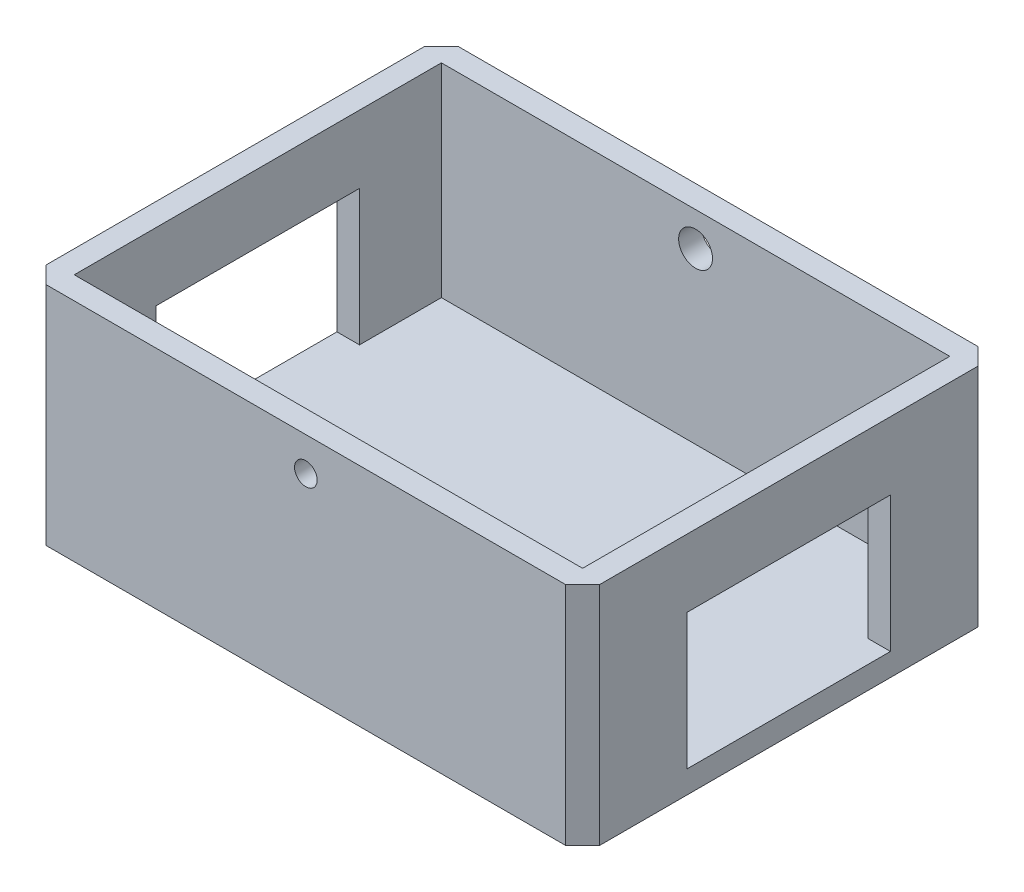
ISO-10303-21;
HEADER;
FILE_DESCRIPTION(('STEP AP214'),'2;1');
FILE_NAME('part.step','',(''),(''),'','','');
FILE_SCHEMA(('AUTOMOTIVE_DESIGN { 1 0 10303 214 1 1 1 1 }'));
ENDSEC;
DATA;
#1=APPLICATION_CONTEXT('core data for automotive mechanical design processes');
#2=APPLICATION_PROTOCOL_DEFINITION('international standard','automotive_design',2000,#1);
#3=PRODUCT_CONTEXT('',#1,'mechanical');
#4=PRODUCT('Part','Part','',(#3));
#5=PRODUCT_RELATED_PRODUCT_CATEGORY('part','',(#4));
#6=PRODUCT_DEFINITION_FORMATION('','',#4);
#7=PRODUCT_DEFINITION_CONTEXT('part definition',#1,'design');
#8=PRODUCT_DEFINITION('design','',#6,#7);
#9=PRODUCT_DEFINITION_SHAPE('','',#8);
#10=(LENGTH_UNIT() NAMED_UNIT(*) SI_UNIT(.MILLI.,.METRE.));
#11=(NAMED_UNIT(*) PLANE_ANGLE_UNIT() SI_UNIT($,.RADIAN.));
#12=(NAMED_UNIT(*) SI_UNIT($,.STERADIAN.) SOLID_ANGLE_UNIT());
#13=UNCERTAINTY_MEASURE_WITH_UNIT(LENGTH_MEASURE(1.E-05),#10,'distance_accuracy_value','');
#14=(GEOMETRIC_REPRESENTATION_CONTEXT(3) GLOBAL_UNCERTAINTY_ASSIGNED_CONTEXT((#13)) GLOBAL_UNIT_ASSIGNED_CONTEXT((#10,
#11,#12)) REPRESENTATION_CONTEXT('',''));
#15=CARTESIAN_POINT('',(0.,0.,0.));
#16=DIRECTION('',(0.,0.,1.));
#17=DIRECTION('',(1.,0.,0.));
#18=AXIS2_PLACEMENT_3D('',#15,#16,#17);
#19=CARTESIAN_POINT('',(-12.25,10.,-9.125));
#20=DIRECTION('',(1.,0.,0.));
#21=DIRECTION('',(0.,0.,-1.));
#22=AXIS2_PLACEMENT_3D('',#19,#20,#21);
#23=PLANE('',#22);
#24=DIRECTION('',(0.,0.,1.));
#25=VECTOR('',#24,1.);
#26=CARTESIAN_POINT('',(-12.25,0.,-9.125));
#27=LINE('',#26,#25);
#28=CARTESIAN_POINT('',(-12.25,0.,-8.375));
#29=VERTEX_POINT('',#28);
#30=CARTESIAN_POINT('',(-12.25,0.,8.375));
#31=VERTEX_POINT('',#30);
#32=EDGE_CURVE('E245',#29,#31,#27,.T.);
#33=ORIENTED_EDGE('',*,*,#32,.T.);
#34=DIRECTION('',(0.,1.,0.));
#35=VECTOR('',#34,1.);
#36=CARTESIAN_POINT('',(-12.25,10.,8.375));
#37=LINE('',#36,#35);
#38=CARTESIAN_POINT('',(-12.25,10.,8.375));
#39=VERTEX_POINT('',#38);
#40=EDGE_CURVE('E265',#31,#39,#37,.T.);
#41=ORIENTED_EDGE('',*,*,#40,.T.);
#42=DIRECTION('',(0.,0.,1.));
#43=VECTOR('',#42,1.);
#44=CARTESIAN_POINT('',(-12.25,10.,-9.125));
#45=LINE('',#44,#43);
#46=CARTESIAN_POINT('',(-12.25,10.,-8.375));
#47=VERTEX_POINT('',#46);
#48=EDGE_CURVE('E231',#47,#39,#45,.T.);
#49=ORIENTED_EDGE('',*,*,#48,.F.);
#50=DIRECTION('',(0.,-1.,0.));
#51=VECTOR('',#50,1.);
#52=CARTESIAN_POINT('',(-12.25,10.,-8.375));
#53=LINE('',#52,#51);
#54=EDGE_CURVE('E262',#47,#29,#53,.T.);
#55=ORIENTED_EDGE('',*,*,#54,.T.);
#56=EDGE_LOOP('',(#33,#41,#49,#55));
#57=FACE_BOUND('',#56,.T.);
#58=DIRECTION('',(0.,1.,0.));
#59=VECTOR('',#58,1.);
#60=CARTESIAN_POINT('',(-12.25,7.,-4.5));
#61=LINE('',#60,#59);
#62=CARTESIAN_POINT('',(-12.25,0.999999999999999,-4.5));
#63=VERTEX_POINT('',#62);
#64=CARTESIAN_POINT('',(-12.25,7.,-4.5));
#65=VERTEX_POINT('',#64);
#66=EDGE_CURVE('E59',#63,#65,#61,.T.);
#67=ORIENTED_EDGE('',*,*,#66,.T.);
#68=DIRECTION('',(0.,0.,1.));
#69=VECTOR('',#68,1.);
#70=CARTESIAN_POINT('',(-12.25,7.,4.5));
#71=LINE('',#70,#69);
#72=CARTESIAN_POINT('',(-12.25,7.,4.5));
#73=VERTEX_POINT('',#72);
#74=EDGE_CURVE('E188',#65,#73,#71,.T.);
#75=ORIENTED_EDGE('',*,*,#74,.T.);
#76=DIRECTION('',(0.,-1.,0.));
#77=VECTOR('',#76,1.);
#78=CARTESIAN_POINT('',(-12.25,7.,4.5));
#79=LINE('',#78,#77);
#80=CARTESIAN_POINT('',(-12.25,1.,4.5));
#81=VERTEX_POINT('',#80);
#82=EDGE_CURVE('E618',#73,#81,#79,.T.);
#83=ORIENTED_EDGE('',*,*,#82,.T.);
#84=DIRECTION('',(0.,0.,-1.));
#85=VECTOR('',#84,1.);
#86=CARTESIAN_POINT('',(-12.25,1.,4.5));
#87=LINE('',#86,#85);
#88=EDGE_CURVE('E621',#81,#63,#87,.T.);
#89=ORIENTED_EDGE('',*,*,#88,.T.);
#90=EDGE_LOOP('',(#67,#75,#83,#89));
#91=FACE_BOUND('',#90,.T.);
#92=ADVANCED_FACE('F43',(#57,#91),#23,.F.);
#93=CARTESIAN_POINT('',(-11.25,10.,-9.125));
#94=DIRECTION('',(1.,0.,0.));
#95=DIRECTION('',(0.,0.,-1.));
#96=AXIS2_PLACEMENT_3D('',#93,#94,#95);
#97=PLANE('',#96);
#98=DIRECTION('',(0.,0.,1.));
#99=VECTOR('',#98,1.);
#100=CARTESIAN_POINT('',(-11.25,7.,4.50000000000001));
#101=LINE('',#100,#99);
#102=CARTESIAN_POINT('',(-11.25,7.,-4.5));
#103=VERTEX_POINT('',#102);
#104=CARTESIAN_POINT('',(-11.25,7.,4.5));
#105=VERTEX_POINT('',#104);
#106=EDGE_CURVE('E196',#103,#105,#101,.T.);
#107=ORIENTED_EDGE('',*,*,#106,.F.);
#108=DIRECTION('',(0.,1.,0.));
#109=VECTOR('',#108,1.);
#110=CARTESIAN_POINT('',(-11.25,7.,-4.5));
#111=LINE('',#110,#109);
#112=CARTESIAN_POINT('',(-11.25,0.999999999999999,-4.5));
#113=VERTEX_POINT('',#112);
#114=EDGE_CURVE('E181',#113,#103,#111,.T.);
#115=ORIENTED_EDGE('',*,*,#114,.F.);
#116=DIRECTION('',(0.,0.,1.));
#117=VECTOR('',#116,1.);
#118=CARTESIAN_POINT('',(-11.25,0.999999999999999,-9.125));
#119=LINE('',#118,#117);
#120=CARTESIAN_POINT('',(-11.25,1.,-8.125));
#121=VERTEX_POINT('',#120);
#122=EDGE_CURVE('E194',#121,#113,#119,.T.);
#123=ORIENTED_EDGE('',*,*,#122,.F.);
#124=DIRECTION('',(0.,-1.,0.));
#125=VECTOR('',#124,1.);
#126=CARTESIAN_POINT('',(-11.25,10.,-8.125));
#127=LINE('',#126,#125);
#128=CARTESIAN_POINT('',(-11.25,10.,-8.125));
#129=VERTEX_POINT('',#128);
#130=EDGE_CURVE('E210',#129,#121,#127,.T.);
#131=ORIENTED_EDGE('',*,*,#130,.F.);
#132=DIRECTION('',(0.,0.,1.));
#133=VECTOR('',#132,1.);
#134=CARTESIAN_POINT('',(-11.25,10.,-9.125));
#135=LINE('',#134,#133);
#136=CARTESIAN_POINT('',(-11.25,10.,8.125));
#137=VERTEX_POINT('',#136);
#138=EDGE_CURVE('E219',#129,#137,#135,.T.);
#139=ORIENTED_EDGE('',*,*,#138,.T.);
#140=DIRECTION('',(0.,-1.,0.));
#141=VECTOR('',#140,1.);
#142=CARTESIAN_POINT('',(-11.25,10.,8.125));
#143=LINE('',#142,#141);
#144=CARTESIAN_POINT('',(-11.25,1.,8.125));
#145=VERTEX_POINT('',#144);
#146=EDGE_CURVE('E212',#137,#145,#143,.T.);
#147=ORIENTED_EDGE('',*,*,#146,.T.);
#148=CARTESIAN_POINT('',(-11.25,0.999999999999999,4.5));
#149=VERTEX_POINT('',#148);
#150=EDGE_CURVE('E204',#149,#145,#119,.T.);
#151=ORIENTED_EDGE('',*,*,#150,.F.);
#152=DIRECTION('',(0.,-1.,0.));
#153=VECTOR('',#152,1.);
#154=CARTESIAN_POINT('',(-11.25,7.,4.5));
#155=LINE('',#154,#153);
#156=EDGE_CURVE('E67',#105,#149,#155,.T.);
#157=ORIENTED_EDGE('',*,*,#156,.F.);
#158=EDGE_LOOP('',(#107,#115,#123,#131,#139,#147,#151,#157));
#159=FACE_BOUND('',#158,.T.);
#160=ADVANCED_FACE('F192',(#159),#97,.T.);
#161=CARTESIAN_POINT('',(12.25,10.,-9.125));
#162=DIRECTION('',(-1.,0.,0.));
#163=DIRECTION('',(0.,0.,1.));
#164=AXIS2_PLACEMENT_3D('',#161,#162,#163);
#165=PLANE('',#164);
#166=DIRECTION('',(0.,0.,1.));
#167=VECTOR('',#166,1.);
#168=CARTESIAN_POINT('',(12.25,7.,4.5));
#169=LINE('',#168,#167);
#170=CARTESIAN_POINT('',(12.25,7.,-4.5));
#171=VERTEX_POINT('',#170);
#172=CARTESIAN_POINT('',(12.25,7.,4.5));
#173=VERTEX_POINT('',#172);
#174=EDGE_CURVE('E606',#171,#173,#169,.T.);
#175=ORIENTED_EDGE('',*,*,#174,.F.);
#176=DIRECTION('',(0.,1.,0.));
#177=VECTOR('',#176,1.);
#178=CARTESIAN_POINT('',(12.25,7.,-4.5));
#179=LINE('',#178,#177);
#180=CARTESIAN_POINT('',(12.25,1.,-4.5));
#181=VERTEX_POINT('',#180);
#182=EDGE_CURVE('E599',#181,#171,#179,.T.);
#183=ORIENTED_EDGE('',*,*,#182,.F.);
#184=DIRECTION('',(0.,0.,-1.));
#185=VECTOR('',#184,1.);
#186=CARTESIAN_POINT('',(12.25,1.,4.5));
#187=LINE('',#186,#185);
#188=CARTESIAN_POINT('',(12.25,1.,4.5));
#189=VERTEX_POINT('',#188);
#190=EDGE_CURVE('E552',#189,#181,#187,.T.);
#191=ORIENTED_EDGE('',*,*,#190,.F.);
#192=DIRECTION('',(0.,-1.,0.));
#193=VECTOR('',#192,1.);
#194=CARTESIAN_POINT('',(12.25,7.,4.5));
#195=LINE('',#194,#193);
#196=EDGE_CURVE('E611',#173,#189,#195,.T.);
#197=ORIENTED_EDGE('',*,*,#196,.F.);
#198=EDGE_LOOP('',(#175,#183,#191,#197));
#199=FACE_BOUND('',#198,.T.);
#200=DIRECTION('',(0.,0.,-1.));
#201=VECTOR('',#200,1.);
#202=CARTESIAN_POINT('',(12.25,0.,-9.125));
#203=LINE('',#202,#201);
#204=CARTESIAN_POINT('',(12.25,0.,8.375));
#205=VERTEX_POINT('',#204);
#206=CARTESIAN_POINT('',(12.25,0.,-8.375));
#207=VERTEX_POINT('',#206);
#208=EDGE_CURVE('E238',#205,#207,#203,.T.);
#209=ORIENTED_EDGE('',*,*,#208,.T.);
#210=DIRECTION('',(0.,1.,0.));
#211=VECTOR('',#210,1.);
#212=CARTESIAN_POINT('',(12.25,10.,-8.375));
#213=LINE('',#212,#211);
#214=CARTESIAN_POINT('',(12.25,10.,-8.375));
#215=VERTEX_POINT('',#214);
#216=EDGE_CURVE('E11',#207,#215,#213,.T.);
#217=ORIENTED_EDGE('',*,*,#216,.T.);
#218=DIRECTION('',(0.,0.,-1.));
#219=VECTOR('',#218,1.);
#220=CARTESIAN_POINT('',(12.25,10.,-9.125));
#221=LINE('',#220,#219);
#222=CARTESIAN_POINT('',(12.25,10.,8.375));
#223=VERTEX_POINT('',#222);
#224=EDGE_CURVE('E224',#223,#215,#221,.T.);
#225=ORIENTED_EDGE('',*,*,#224,.F.);
#226=DIRECTION('',(0.,-1.,0.));
#227=VECTOR('',#226,1.);
#228=CARTESIAN_POINT('',(12.25,10.,8.375));
#229=LINE('',#228,#227);
#230=EDGE_CURVE('E52',#223,#205,#229,.T.);
#231=ORIENTED_EDGE('',*,*,#230,.T.);
#232=EDGE_LOOP('',(#209,#217,#225,#231));
#233=FACE_BOUND('',#232,.T.);
#234=ADVANCED_FACE('F284',(#199,#233),#165,.F.);
#235=CARTESIAN_POINT('',(-12.25,10.,-9.125));
#236=DIRECTION('',(0.,0.,1.));
#237=DIRECTION('',(1.,0.,0.));
#238=AXIS2_PLACEMENT_3D('',#235,#236,#237);
#239=PLANE('',#238);
#240=CARTESIAN_POINT('',(0.,8.5,-9.125));
#241=DIRECTION('',(0.,0.,1.));
#242=DIRECTION('',(1.,0.,0.));
#243=AXIS2_PLACEMENT_3D('',#240,#241,#242);
#244=CIRCLE('',#243,0.75);
#245=CARTESIAN_POINT('',(0.75,8.5,-9.125));
#246=VERTEX_POINT('',#245);
#247=EDGE_CURVE('E549',#246,#246,#244,.F.);
#248=ORIENTED_EDGE('',*,*,#247,.F.);
#249=EDGE_LOOP('',(#248));
#250=FACE_BOUND('',#249,.T.);
#251=DIRECTION('',(-1.,0.,0.));
#252=VECTOR('',#251,1.);
#253=CARTESIAN_POINT('',(-12.25,0.,-9.125));
#254=LINE('',#253,#252);
#255=CARTESIAN_POINT('',(11.5,0.,-9.125));
#256=VERTEX_POINT('',#255);
#257=CARTESIAN_POINT('',(-11.5,0.,-9.125));
#258=VERTEX_POINT('',#257);
#259=EDGE_CURVE('E241',#256,#258,#254,.T.);
#260=ORIENTED_EDGE('',*,*,#259,.T.);
#261=DIRECTION('',(0.,1.,0.));
#262=VECTOR('',#261,1.);
#263=CARTESIAN_POINT('',(-11.5,10.,-9.125));
#264=LINE('',#263,#262);
#265=CARTESIAN_POINT('',(-11.5,10.,-9.125));
#266=VERTEX_POINT('',#265);
#267=EDGE_CURVE('E278',#258,#266,#264,.T.);
#268=ORIENTED_EDGE('',*,*,#267,.T.);
#269=DIRECTION('',(-1.,0.,0.));
#270=VECTOR('',#269,1.);
#271=CARTESIAN_POINT('',(-12.25,10.,-9.125));
#272=LINE('',#271,#270);
#273=CARTESIAN_POINT('',(11.5,10.,-9.125));
#274=VERTEX_POINT('',#273);
#275=EDGE_CURVE('E227',#274,#266,#272,.T.);
#276=ORIENTED_EDGE('',*,*,#275,.F.);
#277=DIRECTION('',(0.,-1.,0.));
#278=VECTOR('',#277,1.);
#279=CARTESIAN_POINT('',(11.5,10.,-9.125));
#280=LINE('',#279,#278);
#281=EDGE_CURVE('E275',#274,#256,#280,.T.);
#282=ORIENTED_EDGE('',*,*,#281,.T.);
#283=EDGE_LOOP('',(#260,#268,#276,#282));
#284=FACE_BOUND('',#283,.T.);
#285=ADVANCED_FACE('F298',(#250,#284),#239,.F.);
#286=CARTESIAN_POINT('',(-12.25,10.,9.125));
#287=DIRECTION('',(0.,0.,-1.));
#288=DIRECTION('',(-1.,0.,0.));
#289=AXIS2_PLACEMENT_3D('',#286,#287,#288);
#290=PLANE('',#289);
#291=CARTESIAN_POINT('',(0.,8.5,9.125));
#292=DIRECTION('',(0.,0.,1.));
#293=DIRECTION('',(1.,0.,0.));
#294=AXIS2_PLACEMENT_3D('',#291,#292,#293);
#295=CIRCLE('',#294,0.500000000000001);
#296=CARTESIAN_POINT('',(0.500000000000001,8.5,9.125));
#297=VERTEX_POINT('',#296);
#298=EDGE_CURVE('E543',#297,#297,#295,.T.);
#299=ORIENTED_EDGE('',*,*,#298,.F.);
#300=EDGE_LOOP('',(#299));
#301=FACE_BOUND('',#300,.T.);
#302=DIRECTION('',(1.,0.,0.));
#303=VECTOR('',#302,1.);
#304=CARTESIAN_POINT('',(-12.25,10.,9.125));
#305=LINE('',#304,#303);
#306=CARTESIAN_POINT('',(-11.5,10.,9.125));
#307=VERTEX_POINT('',#306);
#308=CARTESIAN_POINT('',(11.5,10.,9.125));
#309=VERTEX_POINT('',#308);
#310=EDGE_CURVE('E234',#307,#309,#305,.T.);
#311=ORIENTED_EDGE('',*,*,#310,.F.);
#312=DIRECTION('',(0.,-1.,0.));
#313=VECTOR('',#312,1.);
#314=CARTESIAN_POINT('',(-11.5,10.,9.125));
#315=LINE('',#314,#313);
#316=CARTESIAN_POINT('',(-11.5,0.,9.125));
#317=VERTEX_POINT('',#316);
#318=EDGE_CURVE('E251',#307,#317,#315,.T.);
#319=ORIENTED_EDGE('',*,*,#318,.T.);
#320=DIRECTION('',(1.,0.,0.));
#321=VECTOR('',#320,1.);
#322=CARTESIAN_POINT('',(-12.25,0.,9.125));
#323=LINE('',#322,#321);
#324=CARTESIAN_POINT('',(11.5,0.,9.125));
#325=VERTEX_POINT('',#324);
#326=EDGE_CURVE('E228',#317,#325,#323,.T.);
#327=ORIENTED_EDGE('',*,*,#326,.T.);
#328=DIRECTION('',(0.,1.,0.));
#329=VECTOR('',#328,1.);
#330=CARTESIAN_POINT('',(11.5,10.,9.125));
#331=LINE('',#330,#329);
#332=EDGE_CURVE('E237',#325,#309,#331,.T.);
#333=ORIENTED_EDGE('',*,*,#332,.T.);
#334=EDGE_LOOP('',(#311,#319,#327,#333));
#335=FACE_BOUND('',#334,.T.);
#336=ADVANCED_FACE('F317',(#301,#335),#290,.F.);
#337=CARTESIAN_POINT('',(0.,10.,0.));
#338=DIRECTION('',(0.,1.,0.));
#339=DIRECTION('',(0.,0.,1.));
#340=AXIS2_PLACEMENT_3D('',#337,#338,#339);
#341=PLANE('',#340);
#342=DIRECTION('',(0.,0.,-1.));
#343=VECTOR('',#342,1.);
#344=CARTESIAN_POINT('',(11.25,10.,-9.125));
#345=LINE('',#344,#343);
#346=CARTESIAN_POINT('',(11.25,10.,8.125));
#347=VERTEX_POINT('',#346);
#348=CARTESIAN_POINT('',(11.25,10.,-8.125));
#349=VERTEX_POINT('',#348);
#350=EDGE_CURVE('E206',#347,#349,#345,.T.);
#351=ORIENTED_EDGE('',*,*,#350,.F.);
#352=DIRECTION('',(1.,0.,0.));
#353=VECTOR('',#352,1.);
#354=CARTESIAN_POINT('',(-12.25,10.,8.125));
#355=LINE('',#354,#353);
#356=EDGE_CURVE('E222',#137,#347,#355,.T.);
#357=ORIENTED_EDGE('',*,*,#356,.F.);
#358=ORIENTED_EDGE('',*,*,#138,.F.);
#359=DIRECTION('',(-1.,0.,0.));
#360=VECTOR('',#359,1.);
#361=CARTESIAN_POINT('',(-12.25,10.,-8.125));
#362=LINE('',#361,#360);
#363=EDGE_CURVE('E217',#349,#129,#362,.T.);
#364=ORIENTED_EDGE('',*,*,#363,.F.);
#365=EDGE_LOOP('',(#351,#357,#358,#364));
#366=FACE_BOUND('',#365,.T.);
#367=ORIENTED_EDGE('',*,*,#48,.T.);
#368=DIRECTION('',(-0.707106781186549,0.,-0.707106781186546));
#369=VECTOR('',#368,1.);
#370=CARTESIAN_POINT('',(-10.3125,10.,10.3125));
#371=LINE('',#370,#369);
#372=EDGE_CURVE('E273',#39,#307,#371,.F.);
#373=ORIENTED_EDGE('',*,*,#372,.T.);
#374=ORIENTED_EDGE('',*,*,#310,.T.);
#375=DIRECTION('',(-0.707106781186549,0.,0.707106781186546));
#376=VECTOR('',#375,1.);
#377=CARTESIAN_POINT('',(10.3125,10.,10.3125));
#378=LINE('',#377,#376);
#379=EDGE_CURVE('E267',#309,#223,#378,.F.);
#380=ORIENTED_EDGE('',*,*,#379,.T.);
#381=ORIENTED_EDGE('',*,*,#224,.T.);
#382=DIRECTION('',(0.707106781186548,0.,0.707106781186548));
#383=VECTOR('',#382,1.);
#384=CARTESIAN_POINT('',(10.3125,10.,-10.3125));
#385=LINE('',#384,#383);
#386=EDGE_CURVE('E269',#215,#274,#385,.F.);
#387=ORIENTED_EDGE('',*,*,#386,.T.);
#388=ORIENTED_EDGE('',*,*,#275,.T.);
#389=DIRECTION('',(0.707106781186551,0.,-0.707106781186544));
#390=VECTOR('',#389,1.);
#391=CARTESIAN_POINT('',(-10.3124999999999,10.,-10.3125));
#392=LINE('',#391,#390);
#393=EDGE_CURVE('E271',#266,#47,#392,.F.);
#394=ORIENTED_EDGE('',*,*,#393,.T.);
#395=EDGE_LOOP('',(#367,#373,#374,#380,#381,#387,#388,#394));
#396=FACE_BOUND('',#395,.T.);
#397=ADVANCED_FACE('F302',(#366,#396),#341,.T.);
#398=CARTESIAN_POINT('',(0.,0.,0.));
#399=DIRECTION('',(0.,1.,0.));
#400=DIRECTION('',(0.,0.,1.));
#401=AXIS2_PLACEMENT_3D('',#398,#399,#400);
#402=PLANE('',#401);
#403=ORIENTED_EDGE('',*,*,#326,.F.);
#404=DIRECTION('',(0.707106781186549,0.,0.707106781186546));
#405=VECTOR('',#404,1.);
#406=CARTESIAN_POINT('',(-11.5,0.,9.125));
#407=LINE('',#406,#405);
#408=EDGE_CURVE('E260',#317,#31,#407,.F.);
#409=ORIENTED_EDGE('',*,*,#408,.T.);
#410=ORIENTED_EDGE('',*,*,#32,.F.);
#411=DIRECTION('',(-0.707106781186551,0.,0.707106781186544));
#412=VECTOR('',#411,1.);
#413=CARTESIAN_POINT('',(-12.25,0.,-8.375));
#414=LINE('',#413,#412);
#415=EDGE_CURVE('E258',#29,#258,#414,.F.);
#416=ORIENTED_EDGE('',*,*,#415,.T.);
#417=ORIENTED_EDGE('',*,*,#259,.F.);
#418=DIRECTION('',(-0.707106781186548,0.,-0.707106781186548));
#419=VECTOR('',#418,1.);
#420=CARTESIAN_POINT('',(11.5,0.,-9.125));
#421=LINE('',#420,#419);
#422=EDGE_CURVE('E256',#256,#207,#421,.F.);
#423=ORIENTED_EDGE('',*,*,#422,.T.);
#424=ORIENTED_EDGE('',*,*,#208,.F.);
#425=DIRECTION('',(0.707106781186549,0.,-0.707106781186546));
#426=VECTOR('',#425,1.);
#427=CARTESIAN_POINT('',(12.25,0.,8.375));
#428=LINE('',#427,#426);
#429=EDGE_CURVE('E254',#205,#325,#428,.F.);
#430=ORIENTED_EDGE('',*,*,#429,.T.);
#431=EDGE_LOOP('',(#403,#409,#410,#416,#417,#423,#424,#430));
#432=FACE_BOUND('',#431,.T.);
#433=ADVANCED_FACE('F290',(#432),#402,.F.);
#434=CARTESIAN_POINT('',(11.25,10.,-9.125));
#435=DIRECTION('',(-1.,0.,0.));
#436=DIRECTION('',(0.,0.,1.));
#437=AXIS2_PLACEMENT_3D('',#434,#435,#436);
#438=PLANE('',#437);
#439=DIRECTION('',(0.,1.,0.));
#440=VECTOR('',#439,1.);
#441=CARTESIAN_POINT('',(11.25,7.,-4.5));
#442=LINE('',#441,#440);
#443=CARTESIAN_POINT('',(11.25,0.999999999999999,-4.5));
#444=VERTEX_POINT('',#443);
#445=CARTESIAN_POINT('',(11.25,7.,-4.5));
#446=VERTEX_POINT('',#445);
#447=EDGE_CURVE('E586',#444,#446,#442,.T.);
#448=ORIENTED_EDGE('',*,*,#447,.T.);
#449=DIRECTION('',(0.,0.,1.));
#450=VECTOR('',#449,1.);
#451=CARTESIAN_POINT('',(11.25,7.,4.5));
#452=LINE('',#451,#450);
#453=CARTESIAN_POINT('',(11.25,7.,4.5));
#454=VERTEX_POINT('',#453);
#455=EDGE_CURVE('E602',#446,#454,#452,.T.);
#456=ORIENTED_EDGE('',*,*,#455,.T.);
#457=DIRECTION('',(0.,-1.,0.));
#458=VECTOR('',#457,1.);
#459=CARTESIAN_POINT('',(11.25,7.,4.5));
#460=LINE('',#459,#458);
#461=CARTESIAN_POINT('',(11.25,0.999999999999999,4.5));
#462=VERTEX_POINT('',#461);
#463=EDGE_CURVE('E575',#454,#462,#460,.T.);
#464=ORIENTED_EDGE('',*,*,#463,.T.);
#465=DIRECTION('',(0.,0.,-1.));
#466=VECTOR('',#465,1.);
#467=CARTESIAN_POINT('',(11.25,0.999999999999999,-9.125));
#468=LINE('',#467,#466);
#469=CARTESIAN_POINT('',(11.25,1.,8.125));
#470=VERTEX_POINT('',#469);
#471=EDGE_CURVE('E561',#470,#462,#468,.T.);
#472=ORIENTED_EDGE('',*,*,#471,.F.);
#473=DIRECTION('',(0.,-1.,0.));
#474=VECTOR('',#473,1.);
#475=CARTESIAN_POINT('',(11.25,10.,8.125));
#476=LINE('',#475,#474);
#477=EDGE_CURVE('E214',#347,#470,#476,.T.);
#478=ORIENTED_EDGE('',*,*,#477,.F.);
#479=ORIENTED_EDGE('',*,*,#350,.T.);
#480=DIRECTION('',(0.,-1.,0.));
#481=VECTOR('',#480,1.);
#482=CARTESIAN_POINT('',(11.25,10.,-8.125));
#483=LINE('',#482,#481);
#484=CARTESIAN_POINT('',(11.25,1.,-8.125));
#485=VERTEX_POINT('',#484);
#486=EDGE_CURVE('E242',#349,#485,#483,.T.);
#487=ORIENTED_EDGE('',*,*,#486,.T.);
#488=EDGE_CURVE('E560',#444,#485,#468,.T.);
#489=ORIENTED_EDGE('',*,*,#488,.F.);
#490=EDGE_LOOP('',(#448,#456,#464,#472,#478,#479,#487,#489));
#491=FACE_BOUND('',#490,.T.);
#492=ADVANCED_FACE('F477',(#491),#438,.T.);
#493=CARTESIAN_POINT('',(-12.25,10.,-8.125));
#494=DIRECTION('',(0.,0.,1.));
#495=DIRECTION('',(1.,0.,0.));
#496=AXIS2_PLACEMENT_3D('',#493,#494,#495);
#497=PLANE('',#496);
#498=CARTESIAN_POINT('',(0.,8.5,-8.125));
#499=DIRECTION('',(0.,0.,1.));
#500=DIRECTION('',(1.,0.,0.));
#501=AXIS2_PLACEMENT_3D('',#498,#499,#500);
#502=CIRCLE('',#501,0.75);
#503=CARTESIAN_POINT('',(0.75,8.5,-8.125));
#504=VERTEX_POINT('',#503);
#505=EDGE_CURVE('E545',#504,#504,#502,.T.);
#506=ORIENTED_EDGE('',*,*,#505,.F.);
#507=EDGE_LOOP('',(#506));
#508=FACE_BOUND('',#507,.T.);
#509=DIRECTION('',(-1.,0.,0.));
#510=VECTOR('',#509,1.);
#511=CARTESIAN_POINT('',(-12.25,0.999999999999999,-8.125));
#512=LINE('',#511,#510);
#513=EDGE_CURVE('E201',#485,#121,#512,.T.);
#514=ORIENTED_EDGE('',*,*,#513,.F.);
#515=ORIENTED_EDGE('',*,*,#486,.F.);
#516=ORIENTED_EDGE('',*,*,#363,.T.);
#517=ORIENTED_EDGE('',*,*,#130,.T.);
#518=EDGE_LOOP('',(#514,#515,#516,#517));
#519=FACE_BOUND('',#518,.T.);
#520=ADVANCED_FACE('F479',(#508,#519),#497,.T.);
#521=CARTESIAN_POINT('',(-12.25,10.,8.125));
#522=DIRECTION('',(0.,0.,-1.));
#523=DIRECTION('',(-1.,0.,0.));
#524=AXIS2_PLACEMENT_3D('',#521,#522,#523);
#525=PLANE('',#524);
#526=CARTESIAN_POINT('',(0.,8.5,8.125));
#527=DIRECTION('',(0.,0.,-1.));
#528=DIRECTION('',(-1.,0.,0.));
#529=AXIS2_PLACEMENT_3D('',#526,#527,#528);
#530=CIRCLE('',#529,0.500000000000001);
#531=CARTESIAN_POINT('',(-0.500000000000001,8.5,8.125));
#532=VERTEX_POINT('',#531);
#533=EDGE_CURVE('E546',#532,#532,#530,.F.);
#534=ORIENTED_EDGE('',*,*,#533,.T.);
#535=EDGE_LOOP('',(#534));
#536=FACE_BOUND('',#535,.T.);
#537=DIRECTION('',(1.,0.,0.));
#538=VECTOR('',#537,1.);
#539=CARTESIAN_POINT('',(-12.25,0.999999999999999,8.125));
#540=LINE('',#539,#538);
#541=EDGE_CURVE('E203',#145,#470,#540,.T.);
#542=ORIENTED_EDGE('',*,*,#541,.F.);
#543=ORIENTED_EDGE('',*,*,#146,.F.);
#544=ORIENTED_EDGE('',*,*,#356,.T.);
#545=ORIENTED_EDGE('',*,*,#477,.T.);
#546=EDGE_LOOP('',(#542,#543,#544,#545));
#547=FACE_BOUND('',#546,.T.);
#548=ADVANCED_FACE('F403',(#536,#547),#525,.T.);
#549=CARTESIAN_POINT('',(0.,1.,0.));
#550=DIRECTION('',(0.,1.,0.));
#551=DIRECTION('',(0.,0.,1.));
#552=AXIS2_PLACEMENT_3D('',#549,#550,#551);
#553=PLANE('',#552);
#554=ORIENTED_EDGE('',*,*,#471,.T.);
#555=DIRECTION('',(1.,0.,0.));
#556=VECTOR('',#555,1.);
#557=CARTESIAN_POINT('',(-12.251,1.,4.5));
#558=LINE('',#557,#556);
#559=EDGE_CURVE('E577',#462,#189,#558,.T.);
#560=ORIENTED_EDGE('',*,*,#559,.T.);
#561=ORIENTED_EDGE('',*,*,#190,.T.);
#562=DIRECTION('',(1.,0.,0.));
#563=VECTOR('',#562,1.);
#564=CARTESIAN_POINT('',(-12.251,1.,-4.5));
#565=LINE('',#564,#563);
#566=EDGE_CURVE('E587',#444,#181,#565,.T.);
#567=ORIENTED_EDGE('',*,*,#566,.F.);
#568=ORIENTED_EDGE('',*,*,#488,.T.);
#569=ORIENTED_EDGE('',*,*,#513,.T.);
#570=ORIENTED_EDGE('',*,*,#122,.T.);
#571=DIRECTION('',(-1.,0.,0.));
#572=VECTOR('',#571,1.);
#573=CARTESIAN_POINT('',(12.251,1.,-4.5));
#574=LINE('',#573,#572);
#575=EDGE_CURVE('E178',#113,#63,#574,.T.);
#576=ORIENTED_EDGE('',*,*,#575,.T.);
#577=ORIENTED_EDGE('',*,*,#88,.F.);
#578=DIRECTION('',(-1.,0.,0.));
#579=VECTOR('',#578,1.);
#580=CARTESIAN_POINT('',(12.251,1.,4.5));
#581=LINE('',#580,#579);
#582=EDGE_CURVE('E187',#149,#81,#581,.T.);
#583=ORIENTED_EDGE('',*,*,#582,.F.);
#584=ORIENTED_EDGE('',*,*,#150,.T.);
#585=ORIENTED_EDGE('',*,*,#541,.T.);
#586=EDGE_LOOP('',(#554,#560,#561,#567,#568,#569,#570,#576,#577,#583,#584,#585));
#587=FACE_BOUND('',#586,.T.);
#588=ADVANCED_FACE('F199',(#587),#553,.T.);
#589=CARTESIAN_POINT('',(-11.5,10.,9.125));
#590=DIRECTION('',(0.707106781186546,0.,-0.707106781186549));
#591=DIRECTION('',(0.,-1.,0.));
#592=AXIS2_PLACEMENT_3D('',#589,#590,#591);
#593=PLANE('',#592);
#594=ORIENTED_EDGE('',*,*,#372,.F.);
#595=ORIENTED_EDGE('',*,*,#40,.F.);
#596=ORIENTED_EDGE('',*,*,#408,.F.);
#597=ORIENTED_EDGE('',*,*,#318,.F.);
#598=EDGE_LOOP('',(#594,#595,#596,#597));
#599=FACE_BOUND('',#598,.T.);
#600=ADVANCED_FACE('F314',(#599),#593,.F.);
#601=CARTESIAN_POINT('',(-12.25,10.,-8.375));
#602=DIRECTION('',(0.707106781186544,0.,0.707106781186551));
#603=DIRECTION('',(0.,-1.,0.));
#604=AXIS2_PLACEMENT_3D('',#601,#602,#603);
#605=PLANE('',#604);
#606=ORIENTED_EDGE('',*,*,#393,.F.);
#607=ORIENTED_EDGE('',*,*,#267,.F.);
#608=ORIENTED_EDGE('',*,*,#415,.F.);
#609=ORIENTED_EDGE('',*,*,#54,.F.);
#610=EDGE_LOOP('',(#606,#607,#608,#609));
#611=FACE_BOUND('',#610,.T.);
#612=ADVANCED_FACE('F306',(#611),#605,.F.);
#613=CARTESIAN_POINT('',(11.5,10.,-9.125));
#614=DIRECTION('',(-0.707106781186548,0.,0.707106781186548));
#615=DIRECTION('',(0.,-1.,0.));
#616=AXIS2_PLACEMENT_3D('',#613,#614,#615);
#617=PLANE('',#616);
#618=ORIENTED_EDGE('',*,*,#386,.F.);
#619=ORIENTED_EDGE('',*,*,#216,.F.);
#620=ORIENTED_EDGE('',*,*,#422,.F.);
#621=ORIENTED_EDGE('',*,*,#281,.F.);
#622=EDGE_LOOP('',(#618,#619,#620,#621));
#623=FACE_BOUND('',#622,.T.);
#624=ADVANCED_FACE('F295',(#623),#617,.F.);
#625=CARTESIAN_POINT('',(12.25,10.,8.375));
#626=DIRECTION('',(-0.707106781186546,0.,-0.707106781186549));
#627=DIRECTION('',(0.,-1.,0.));
#628=AXIS2_PLACEMENT_3D('',#625,#626,#627);
#629=PLANE('',#628);
#630=ORIENTED_EDGE('',*,*,#379,.F.);
#631=ORIENTED_EDGE('',*,*,#332,.F.);
#632=ORIENTED_EDGE('',*,*,#429,.F.);
#633=ORIENTED_EDGE('',*,*,#230,.F.);
#634=EDGE_LOOP('',(#630,#631,#632,#633));
#635=FACE_BOUND('',#634,.T.);
#636=ADVANCED_FACE('F46',(#635),#629,.F.);
#637=CARTESIAN_POINT('',(0.,8.5,-9.126));
#638=DIRECTION('',(0.,0.,1.));
#639=DIRECTION('',(1.,0.,0.));
#640=AXIS2_PLACEMENT_3D('',#637,#638,#639);
#641=CYLINDRICAL_SURFACE('',#640,0.75);
#642=ORIENTED_EDGE('',*,*,#505,.T.);
#643=EDGE_LOOP('',(#642));
#644=FACE_BOUND('',#643,.T.);
#645=ORIENTED_EDGE('',*,*,#247,.T.);
#646=EDGE_LOOP('',(#645));
#647=FACE_BOUND('',#646,.T.);
#648=ADVANCED_FACE('F320',(#644,#647),#641,.F.);
#649=CARTESIAN_POINT('',(0.,8.5,-9.126));
#650=DIRECTION('',(0.,0.,1.));
#651=DIRECTION('',(1.,0.,0.));
#652=AXIS2_PLACEMENT_3D('',#649,#650,#651);
#653=CYLINDRICAL_SURFACE('',#652,0.500000000000001);
#654=ORIENTED_EDGE('',*,*,#533,.F.);
#655=EDGE_LOOP('',(#654));
#656=FACE_BOUND('',#655,.T.);
#657=ORIENTED_EDGE('',*,*,#298,.T.);
#658=EDGE_LOOP('',(#657));
#659=FACE_BOUND('',#658,.T.);
#660=ADVANCED_FACE('F326',(#656,#659),#653,.F.);
#661=CARTESIAN_POINT('',(-12.251,7.,-4.5));
#662=DIRECTION('',(0.,0.,-1.));
#663=DIRECTION('',(-1.,0.,0.));
#664=AXIS2_PLACEMENT_3D('',#661,#662,#663);
#665=PLANE('',#664);
#666=ORIENTED_EDGE('',*,*,#566,.T.);
#667=ORIENTED_EDGE('',*,*,#182,.T.);
#668=DIRECTION('',(1.,0.,0.));
#669=VECTOR('',#668,1.);
#670=CARTESIAN_POINT('',(-12.251,7.,-4.5));
#671=LINE('',#670,#669);
#672=EDGE_CURVE('E555',#446,#171,#671,.T.);
#673=ORIENTED_EDGE('',*,*,#672,.F.);
#674=ORIENTED_EDGE('',*,*,#447,.F.);
#675=EDGE_LOOP('',(#666,#667,#673,#674));
#676=FACE_BOUND('',#675,.T.);
#677=ADVANCED_FACE('F390',(#676),#665,.F.);
#678=CARTESIAN_POINT('',(-12.251,7.,4.5));
#679=DIRECTION('',(0.,0.,1.));
#680=DIRECTION('',(1.,0.,0.));
#681=AXIS2_PLACEMENT_3D('',#678,#679,#680);
#682=PLANE('',#681);
#683=DIRECTION('',(1.,0.,0.));
#684=VECTOR('',#683,1.);
#685=CARTESIAN_POINT('',(-12.251,7.,4.5));
#686=LINE('',#685,#684);
#687=EDGE_CURVE('E603',#454,#173,#686,.T.);
#688=ORIENTED_EDGE('',*,*,#687,.T.);
#689=ORIENTED_EDGE('',*,*,#196,.T.);
#690=ORIENTED_EDGE('',*,*,#559,.F.);
#691=ORIENTED_EDGE('',*,*,#463,.F.);
#692=EDGE_LOOP('',(#688,#689,#690,#691));
#693=FACE_BOUND('',#692,.T.);
#694=ADVANCED_FACE('F417',(#693),#682,.F.);
#695=CARTESIAN_POINT('',(-12.251,7.,4.5));
#696=DIRECTION('',(0.,1.,0.));
#697=DIRECTION('',(0.,0.,1.));
#698=AXIS2_PLACEMENT_3D('',#695,#696,#697);
#699=PLANE('',#698);
#700=ORIENTED_EDGE('',*,*,#672,.T.);
#701=ORIENTED_EDGE('',*,*,#174,.T.);
#702=ORIENTED_EDGE('',*,*,#687,.F.);
#703=ORIENTED_EDGE('',*,*,#455,.F.);
#704=EDGE_LOOP('',(#700,#701,#702,#703));
#705=FACE_BOUND('',#704,.T.);
#706=ADVANCED_FACE('F428',(#705),#699,.F.);
#707=CARTESIAN_POINT('',(12.251,7.,-4.5));
#708=DIRECTION('',(0.,0.,1.));
#709=DIRECTION('',(1.,0.,0.));
#710=AXIS2_PLACEMENT_3D('',#707,#708,#709);
#711=PLANE('',#710);
#712=ORIENTED_EDGE('',*,*,#114,.T.);
#713=DIRECTION('',(-1.,0.,0.));
#714=VECTOR('',#713,1.);
#715=CARTESIAN_POINT('',(12.251,7.,-4.5));
#716=LINE('',#715,#714);
#717=EDGE_CURVE('E593',#103,#65,#716,.T.);
#718=ORIENTED_EDGE('',*,*,#717,.T.);
#719=ORIENTED_EDGE('',*,*,#66,.F.);
#720=ORIENTED_EDGE('',*,*,#575,.F.);
#721=EDGE_LOOP('',(#712,#718,#719,#720));
#722=FACE_BOUND('',#721,.T.);
#723=ADVANCED_FACE('F180',(#722),#711,.T.);
#724=CARTESIAN_POINT('',(12.251,7.,4.5));
#725=DIRECTION('',(0.,-1.,0.));
#726=DIRECTION('',(0.,0.,-1.));
#727=AXIS2_PLACEMENT_3D('',#724,#725,#726);
#728=PLANE('',#727);
#729=ORIENTED_EDGE('',*,*,#106,.T.);
#730=DIRECTION('',(-1.,0.,0.));
#731=VECTOR('',#730,1.);
#732=CARTESIAN_POINT('',(12.251,7.,4.5));
#733=LINE('',#732,#731);
#734=EDGE_CURVE('E595',#105,#73,#733,.T.);
#735=ORIENTED_EDGE('',*,*,#734,.T.);
#736=ORIENTED_EDGE('',*,*,#74,.F.);
#737=ORIENTED_EDGE('',*,*,#717,.F.);
#738=EDGE_LOOP('',(#729,#735,#736,#737));
#739=FACE_BOUND('',#738,.T.);
#740=ADVANCED_FACE('F452',(#739),#728,.T.);
#741=CARTESIAN_POINT('',(12.251,7.,4.5));
#742=DIRECTION('',(0.,0.,-1.));
#743=DIRECTION('',(-1.,0.,0.));
#744=AXIS2_PLACEMENT_3D('',#741,#742,#743);
#745=PLANE('',#744);
#746=ORIENTED_EDGE('',*,*,#156,.T.);
#747=ORIENTED_EDGE('',*,*,#582,.T.);
#748=ORIENTED_EDGE('',*,*,#82,.F.);
#749=ORIENTED_EDGE('',*,*,#734,.F.);
#750=EDGE_LOOP('',(#746,#747,#748,#749));
#751=FACE_BOUND('',#750,.T.);
#752=ADVANCED_FACE('F460',(#751),#745,.T.);
#753=CLOSED_SHELL('',(#92,#160,#234,#285,#336,#397,#433,#492,#520,#548,#588,#600,#612,#624,#636,
#648,#660,#677,#694,#706,#723,#740,#752));
#754=MANIFOLD_SOLID_BREP('B2',#753);
#755=ADVANCED_BREP_SHAPE_REPRESENTATION('',(#18,#754),#14);
#756=SHAPE_DEFINITION_REPRESENTATION(#9,#755);
ENDSEC;
END-ISO-10303-21;
